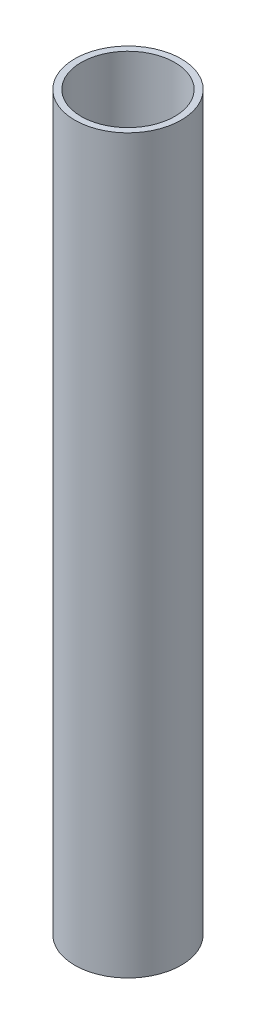
ISO-10303-21;
HEADER;
FILE_DESCRIPTION(('STEP AP214'),'2;1');
FILE_NAME('part.step','',(''),(''),'','','');
FILE_SCHEMA(('AUTOMOTIVE_DESIGN { 1 0 10303 214 1 1 1 1 }'));
ENDSEC;
DATA;
#1=APPLICATION_CONTEXT('core data for automotive mechanical design processes');
#2=APPLICATION_PROTOCOL_DEFINITION('international standard','automotive_design',2000,#1);
#3=PRODUCT_CONTEXT('',#1,'mechanical');
#4=PRODUCT('Part','Part','',(#3));
#5=PRODUCT_RELATED_PRODUCT_CATEGORY('part','',(#4));
#6=PRODUCT_DEFINITION_FORMATION('','',#4);
#7=PRODUCT_DEFINITION_CONTEXT('part definition',#1,'design');
#8=PRODUCT_DEFINITION('design','',#6,#7);
#9=PRODUCT_DEFINITION_SHAPE('','',#8);
#10=(LENGTH_UNIT() NAMED_UNIT(*) SI_UNIT(.MILLI.,.METRE.));
#11=(NAMED_UNIT(*) PLANE_ANGLE_UNIT() SI_UNIT($,.RADIAN.));
#12=(NAMED_UNIT(*) SI_UNIT($,.STERADIAN.) SOLID_ANGLE_UNIT());
#13=UNCERTAINTY_MEASURE_WITH_UNIT(LENGTH_MEASURE(1.E-05),#10,'distance_accuracy_value','');
#14=(GEOMETRIC_REPRESENTATION_CONTEXT(3) GLOBAL_UNCERTAINTY_ASSIGNED_CONTEXT((#13)) GLOBAL_UNIT_ASSIGNED_CONTEXT((#10,
#11,#12)) REPRESENTATION_CONTEXT('',''));
#15=CARTESIAN_POINT('',(0.,0.,0.));
#16=DIRECTION('',(0.,0.,1.));
#17=DIRECTION('',(1.,0.,0.));
#18=AXIS2_PLACEMENT_3D('',#15,#16,#17);
#19=CARTESIAN_POINT('',(0.,172.,0.));
#20=DIRECTION('',(0.,1.,0.));
#21=DIRECTION('',(0.,0.,1.));
#22=AXIS2_PLACEMENT_3D('',#19,#20,#21);
#23=PLANE('',#22);
#24=CARTESIAN_POINT('',(0.,172.,0.));
#25=DIRECTION('',(0.,1.,0.));
#26=DIRECTION('',(0.,0.,1.));
#27=AXIS2_PLACEMENT_3D('',#24,#25,#26);
#28=CIRCLE('',#27,12.5);
#29=CARTESIAN_POINT('',(0.,172.,12.5));
#30=VERTEX_POINT('',#29);
#31=EDGE_CURVE('E10',#30,#30,#28,.T.);
#32=ORIENTED_EDGE('',*,*,#31,.T.);
#33=EDGE_LOOP('',(#32));
#34=FACE_BOUND('',#33,.T.);
#35=CARTESIAN_POINT('',(0.,172.,0.));
#36=DIRECTION('',(0.,1.,0.));
#37=DIRECTION('',(0.,0.,1.));
#38=AXIS2_PLACEMENT_3D('',#35,#36,#37);
#39=CIRCLE('',#38,11.);
#40=CARTESIAN_POINT('',(0.,172.,11.));
#41=VERTEX_POINT('',#40);
#42=EDGE_CURVE('E44',#41,#41,#39,.T.);
#43=ORIENTED_EDGE('',*,*,#42,.F.);
#44=EDGE_LOOP('',(#43));
#45=FACE_BOUND('',#44,.T.);
#46=ADVANCED_FACE('F33',(#34,#45),#23,.T.);
#47=CARTESIAN_POINT('',(0.,0.,0.));
#48=DIRECTION('',(0.,1.,0.));
#49=DIRECTION('',(0.,0.,1.));
#50=AXIS2_PLACEMENT_3D('',#47,#48,#49);
#51=PLANE('',#50);
#52=CARTESIAN_POINT('',(0.,0.,0.));
#53=DIRECTION('',(0.,1.,0.));
#54=DIRECTION('',(0.,0.,1.));
#55=AXIS2_PLACEMENT_3D('',#52,#53,#54);
#56=CIRCLE('',#55,12.5);
#57=CARTESIAN_POINT('',(0.,0.,12.5));
#58=VERTEX_POINT('',#57);
#59=EDGE_CURVE('E37',#58,#58,#56,.T.);
#60=ORIENTED_EDGE('',*,*,#59,.F.);
#61=EDGE_LOOP('',(#60));
#62=FACE_BOUND('',#61,.T.);
#63=CARTESIAN_POINT('',(0.,0.,0.));
#64=DIRECTION('',(0.,1.,0.));
#65=DIRECTION('',(0.,0.,1.));
#66=AXIS2_PLACEMENT_3D('',#63,#64,#65);
#67=CIRCLE('',#66,11.);
#68=CARTESIAN_POINT('',(0.,0.,11.));
#69=VERTEX_POINT('',#68);
#70=EDGE_CURVE('E46',#69,#69,#67,.T.);
#71=ORIENTED_EDGE('',*,*,#70,.T.);
#72=EDGE_LOOP('',(#71));
#73=FACE_BOUND('',#72,.T.);
#74=ADVANCED_FACE('F56',(#62,#73),#51,.F.);
#75=CARTESIAN_POINT('',(0.,172.,0.));
#76=DIRECTION('',(0.,-1.,0.));
#77=DIRECTION('',(0.,0.,-1.));
#78=AXIS2_PLACEMENT_3D('',#75,#76,#77);
#79=CYLINDRICAL_SURFACE('',#78,12.5);
#80=ORIENTED_EDGE('',*,*,#31,.F.);
#81=EDGE_LOOP('',(#80));
#82=FACE_BOUND('',#81,.T.);
#83=ORIENTED_EDGE('',*,*,#59,.T.);
#84=EDGE_LOOP('',(#83));
#85=FACE_BOUND('',#84,.T.);
#86=ADVANCED_FACE('F35',(#82,#85),#79,.T.);
#87=CARTESIAN_POINT('',(0.,172.,0.));
#88=DIRECTION('',(0.,-1.,0.));
#89=DIRECTION('',(0.,0.,-1.));
#90=AXIS2_PLACEMENT_3D('',#87,#88,#89);
#91=CYLINDRICAL_SURFACE('',#90,11.);
#92=ORIENTED_EDGE('',*,*,#42,.T.);
#93=EDGE_LOOP('',(#92));
#94=FACE_BOUND('',#93,.T.);
#95=ORIENTED_EDGE('',*,*,#70,.F.);
#96=EDGE_LOOP('',(#95));
#97=FACE_BOUND('',#96,.T.);
#98=ADVANCED_FACE('F52',(#94,#97),#91,.F.);
#99=CLOSED_SHELL('',(#46,#74,#86,#98));
#100=MANIFOLD_SOLID_BREP('B2',#99);
#101=ADVANCED_BREP_SHAPE_REPRESENTATION('',(#18,#100),#14);
#102=SHAPE_DEFINITION_REPRESENTATION(#9,#101);
ENDSEC;
END-ISO-10303-21;
